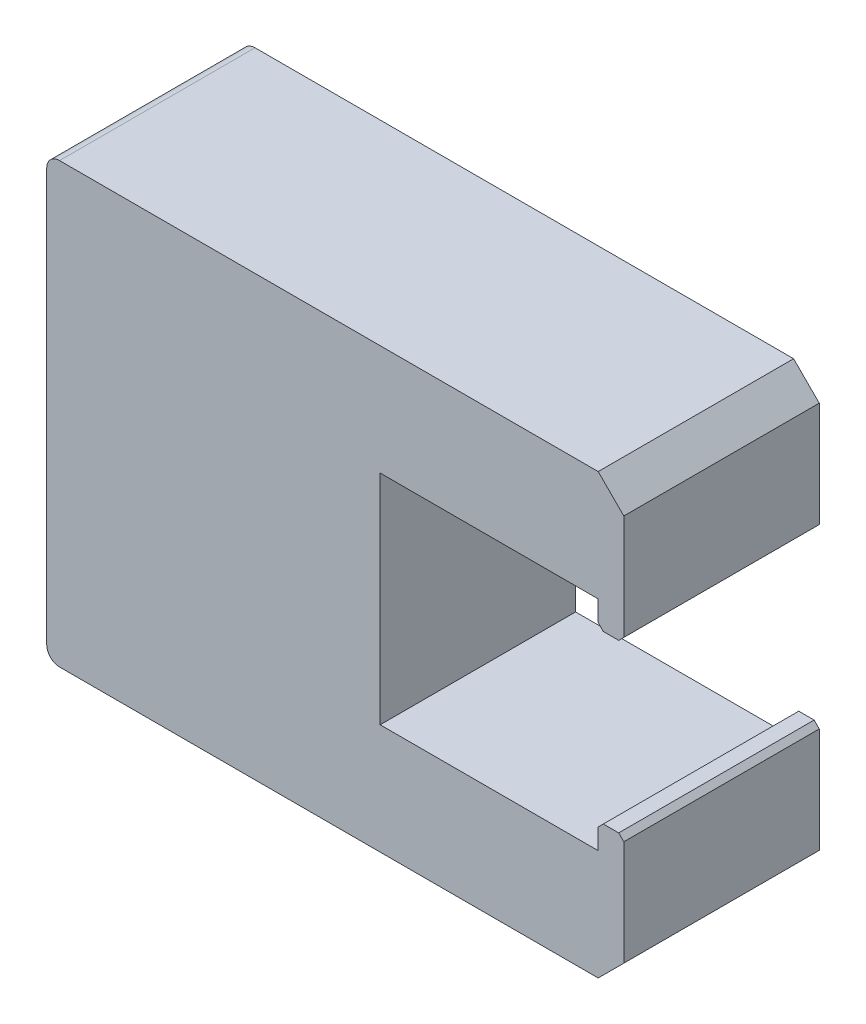
ISO-10303-21;
HEADER;
FILE_DESCRIPTION(('STEP AP214'),'2;1');
FILE_NAME('part.step','',(''),(''),'','','');
FILE_SCHEMA(('AUTOMOTIVE_DESIGN { 1 0 10303 214 1 1 1 1 }'));
ENDSEC;
DATA;
#1=APPLICATION_CONTEXT('core data for automotive mechanical design processes');
#2=APPLICATION_PROTOCOL_DEFINITION('international standard','automotive_design',2000,#1);
#3=PRODUCT_CONTEXT('',#1,'mechanical');
#4=PRODUCT('Part','Part','',(#3));
#5=PRODUCT_RELATED_PRODUCT_CATEGORY('part','',(#4));
#6=PRODUCT_DEFINITION_FORMATION('','',#4);
#7=PRODUCT_DEFINITION_CONTEXT('part definition',#1,'design');
#8=PRODUCT_DEFINITION('design','',#6,#7);
#9=PRODUCT_DEFINITION_SHAPE('','',#8);
#10=(LENGTH_UNIT() NAMED_UNIT(*) SI_UNIT(.MILLI.,.METRE.));
#11=(NAMED_UNIT(*) PLANE_ANGLE_UNIT() SI_UNIT($,.RADIAN.));
#12=(NAMED_UNIT(*) SI_UNIT($,.STERADIAN.) SOLID_ANGLE_UNIT());
#13=UNCERTAINTY_MEASURE_WITH_UNIT(LENGTH_MEASURE(1.E-05),#10,'distance_accuracy_value','');
#14=(GEOMETRIC_REPRESENTATION_CONTEXT(3) GLOBAL_UNCERTAINTY_ASSIGNED_CONTEXT((#13)) GLOBAL_UNIT_ASSIGNED_CONTEXT((#10,
#11,#12)) REPRESENTATION_CONTEXT('',''));
#15=CARTESIAN_POINT('',(0.,0.,0.));
#16=DIRECTION('',(0.,0.,1.));
#17=DIRECTION('',(1.,0.,0.));
#18=AXIS2_PLACEMENT_3D('',#15,#16,#17);
#19=CARTESIAN_POINT('',(0.,0.,38.1));
#20=DIRECTION('',(1.,0.,0.));
#21=DIRECTION('',(0.,0.,-1.));
#22=AXIS2_PLACEMENT_3D('',#19,#20,#21);
#23=PLANE('',#22);
#24=DIRECTION('',(0.,-1.,0.));
#25=VECTOR('',#24,1.);
#26=CARTESIAN_POINT('',(0.,0.,38.1));
#27=LINE('',#26,#25);
#28=CARTESIAN_POINT('',(0.,166.,38.1));
#29=VERTEX_POINT('',#28);
#30=CARTESIAN_POINT('',(0.,5.,38.1));
#31=VERTEX_POINT('',#30);
#32=EDGE_CURVE('E245',#29,#31,#27,.T.);
#33=ORIENTED_EDGE('',*,*,#32,.F.);
#34=DIRECTION('',(0.,0.,-1.));
#35=VECTOR('',#34,1.);
#36=CARTESIAN_POINT('',(0.,166.,38.1));
#37=LINE('',#36,#35);
#38=CARTESIAN_POINT('',(0.,166.,-38.1));
#39=VERTEX_POINT('',#38);
#40=EDGE_CURVE('E309',#29,#39,#37,.T.);
#41=ORIENTED_EDGE('',*,*,#40,.T.);
#42=DIRECTION('',(0.,-1.,0.));
#43=VECTOR('',#42,1.);
#44=CARTESIAN_POINT('',(0.,0.,-38.1));
#45=LINE('',#44,#43);
#46=CARTESIAN_POINT('',(0.,5.,-38.1));
#47=VERTEX_POINT('',#46);
#48=EDGE_CURVE('E217',#39,#47,#45,.T.);
#49=ORIENTED_EDGE('',*,*,#48,.T.);
#50=DIRECTION('',(0.,0.,-1.));
#51=VECTOR('',#50,1.);
#52=CARTESIAN_POINT('',(0.,5.,38.1));
#53=LINE('',#52,#51);
#54=EDGE_CURVE('E307',#47,#31,#53,.F.);
#55=ORIENTED_EDGE('',*,*,#54,.T.);
#56=EDGE_LOOP('',(#33,#41,#49,#55));
#57=FACE_BOUND('',#56,.T.);
#58=ADVANCED_FACE('F34',(#57),#23,.F.);
#59=CARTESIAN_POINT('',(0.,0.,38.1));
#60=DIRECTION('',(0.,1.,0.));
#61=DIRECTION('',(0.,0.,1.));
#62=AXIS2_PLACEMENT_3D('',#59,#60,#61);
#63=PLANE('',#62);
#64=DIRECTION('',(1.,0.,0.));
#65=VECTOR('',#64,1.);
#66=CARTESIAN_POINT('',(0.,0.,38.1));
#67=LINE('',#66,#65);
#68=CARTESIAN_POINT('',(5.,0.,38.1));
#69=VERTEX_POINT('',#68);
#70=CARTESIAN_POINT('',(215.,0.,38.1));
#71=VERTEX_POINT('',#70);
#72=EDGE_CURVE('E324',#69,#71,#67,.T.);
#73=ORIENTED_EDGE('',*,*,#72,.F.);
#74=DIRECTION('',(0.,0.,-1.));
#75=VECTOR('',#74,1.);
#76=CARTESIAN_POINT('',(5.,0.,38.1));
#77=LINE('',#76,#75);
#78=CARTESIAN_POINT('',(5.,0.,-38.1));
#79=VERTEX_POINT('',#78);
#80=EDGE_CURVE('E11',#69,#79,#77,.T.);
#81=ORIENTED_EDGE('',*,*,#80,.T.);
#82=DIRECTION('',(1.,0.,0.));
#83=VECTOR('',#82,1.);
#84=CARTESIAN_POINT('',(0.,0.,-38.1));
#85=LINE('',#84,#83);
#86=CARTESIAN_POINT('',(215.,0.,-38.1));
#87=VERTEX_POINT('',#86);
#88=EDGE_CURVE('E220',#79,#87,#85,.T.);
#89=ORIENTED_EDGE('',*,*,#88,.T.);
#90=DIRECTION('',(0.,0.,1.));
#91=VECTOR('',#90,1.);
#92=CARTESIAN_POINT('',(215.,0.,38.1));
#93=LINE('',#92,#91);
#94=EDGE_CURVE('E270',#87,#71,#93,.T.);
#95=ORIENTED_EDGE('',*,*,#94,.T.);
#96=EDGE_LOOP('',(#73,#81,#89,#95));
#97=FACE_BOUND('',#96,.T.);
#98=ADVANCED_FACE('F376',(#97),#63,.F.);
#99=CARTESIAN_POINT('',(225.,0.,38.1));
#100=DIRECTION('',(-1.,0.,0.));
#101=DIRECTION('',(0.,0.,1.));
#102=AXIS2_PLACEMENT_3D('',#99,#100,#101);
#103=PLANE('',#102);
#104=DIRECTION('',(0.,1.,0.));
#105=VECTOR('',#104,1.);
#106=CARTESIAN_POINT('',(225.,0.,-38.1));
#107=LINE('',#106,#105);
#108=CARTESIAN_POINT('',(225.,9.99999999999998,-38.1));
#109=VERTEX_POINT('',#108);
#110=CARTESIAN_POINT('',(225.,51.,-38.1));
#111=VERTEX_POINT('',#110);
#112=EDGE_CURVE('E222',#109,#111,#107,.T.);
#113=ORIENTED_EDGE('',*,*,#112,.T.);
#114=DIRECTION('',(0.,0.,1.));
#115=VECTOR('',#114,1.);
#116=CARTESIAN_POINT('',(225.,51.,38.1));
#117=LINE('',#116,#115);
#118=CARTESIAN_POINT('',(225.,51.,38.1));
#119=VERTEX_POINT('',#118);
#120=EDGE_CURVE('E305',#111,#119,#117,.T.);
#121=ORIENTED_EDGE('',*,*,#120,.T.);
#122=DIRECTION('',(0.,1.,0.));
#123=VECTOR('',#122,1.);
#124=CARTESIAN_POINT('',(225.,0.,38.1));
#125=LINE('',#124,#123);
#126=CARTESIAN_POINT('',(225.,10.,38.1));
#127=VERTEX_POINT('',#126);
#128=EDGE_CURVE('E418',#127,#119,#125,.T.);
#129=ORIENTED_EDGE('',*,*,#128,.F.);
#130=DIRECTION('',(0.,0.,-1.));
#131=VECTOR('',#130,1.);
#132=CARTESIAN_POINT('',(225.,10.,38.1));
#133=LINE('',#132,#131);
#134=EDGE_CURVE('E267',#127,#109,#133,.T.);
#135=ORIENTED_EDGE('',*,*,#134,.T.);
#136=EDGE_LOOP('',(#113,#121,#129,#135));
#137=FACE_BOUND('',#136,.T.);
#138=ADVANCED_FACE('F381',(#137),#103,.F.);
#139=CARTESIAN_POINT('',(215.,53.,38.1));
#140=DIRECTION('',(0.,-1.,0.));
#141=DIRECTION('',(0.,0.,-1.));
#142=AXIS2_PLACEMENT_3D('',#139,#140,#141);
#143=PLANE('',#142);
#144=DIRECTION('',(-1.,0.,0.));
#145=VECTOR('',#144,1.);
#146=CARTESIAN_POINT('',(215.,53.,-38.1));
#147=LINE('',#146,#145);
#148=CARTESIAN_POINT('',(223.,53.,-38.1));
#149=VERTEX_POINT('',#148);
#150=CARTESIAN_POINT('',(217.,53.,-38.1));
#151=VERTEX_POINT('',#150);
#152=EDGE_CURVE('E225',#149,#151,#147,.T.);
#153=ORIENTED_EDGE('',*,*,#152,.T.);
#154=DIRECTION('',(0.,0.,1.));
#155=VECTOR('',#154,1.);
#156=CARTESIAN_POINT('',(217.,53.,38.1));
#157=LINE('',#156,#155);
#158=CARTESIAN_POINT('',(217.,53.,38.1));
#159=VERTEX_POINT('',#158);
#160=EDGE_CURVE('E300',#151,#159,#157,.T.);
#161=ORIENTED_EDGE('',*,*,#160,.T.);
#162=DIRECTION('',(-1.,0.,0.));
#163=VECTOR('',#162,1.);
#164=CARTESIAN_POINT('',(215.,53.,38.1));
#165=LINE('',#164,#163);
#166=CARTESIAN_POINT('',(223.,53.,38.1));
#167=VERTEX_POINT('',#166);
#168=EDGE_CURVE('E184',#167,#159,#165,.T.);
#169=ORIENTED_EDGE('',*,*,#168,.F.);
#170=DIRECTION('',(0.,0.,-1.));
#171=VECTOR('',#170,1.);
#172=CARTESIAN_POINT('',(223.,53.,38.1));
#173=LINE('',#172,#171);
#174=EDGE_CURVE('E297',#167,#149,#173,.T.);
#175=ORIENTED_EDGE('',*,*,#174,.T.);
#176=EDGE_LOOP('',(#153,#161,#169,#175));
#177=FACE_BOUND('',#176,.T.);
#178=ADVANCED_FACE('F429',(#177),#143,.F.);
#179=CARTESIAN_POINT('',(215.,43.,38.1));
#180=DIRECTION('',(1.,0.,0.));
#181=DIRECTION('',(0.,0.,-1.));
#182=AXIS2_PLACEMENT_3D('',#179,#180,#181);
#183=PLANE('',#182);
#184=DIRECTION('',(0.,-1.,0.));
#185=VECTOR('',#184,1.);
#186=CARTESIAN_POINT('',(215.,43.,38.1));
#187=LINE('',#186,#185);
#188=CARTESIAN_POINT('',(215.,51.,38.1));
#189=VERTEX_POINT('',#188);
#190=CARTESIAN_POINT('',(215.,43.,38.1));
#191=VERTEX_POINT('',#190);
#192=EDGE_CURVE('E172',#189,#191,#187,.T.);
#193=ORIENTED_EDGE('',*,*,#192,.F.);
#194=DIRECTION('',(0.,0.,-1.));
#195=VECTOR('',#194,1.);
#196=CARTESIAN_POINT('',(215.,51.,38.1));
#197=LINE('',#196,#195);
#198=CARTESIAN_POINT('',(215.,51.,-38.1));
#199=VERTEX_POINT('',#198);
#200=EDGE_CURVE('E295',#189,#199,#197,.T.);
#201=ORIENTED_EDGE('',*,*,#200,.T.);
#202=DIRECTION('',(0.,-1.,0.));
#203=VECTOR('',#202,1.);
#204=CARTESIAN_POINT('',(215.,43.,-38.1));
#205=LINE('',#204,#203);
#206=CARTESIAN_POINT('',(215.,43.,-38.1));
#207=VERTEX_POINT('',#206);
#208=EDGE_CURVE('E190',#199,#207,#205,.T.);
#209=ORIENTED_EDGE('',*,*,#208,.T.);
#210=DIRECTION('',(0.,0.,-1.));
#211=VECTOR('',#210,1.);
#212=CARTESIAN_POINT('',(215.,43.,38.1));
#213=LINE('',#212,#211);
#214=EDGE_CURVE('E187',#191,#207,#213,.T.);
#215=ORIENTED_EDGE('',*,*,#214,.F.);
#216=EDGE_LOOP('',(#193,#201,#209,#215));
#217=FACE_BOUND('',#216,.T.);
#218=ADVANCED_FACE('F188',(#217),#183,.F.);
#219=CARTESIAN_POINT('',(215.,43.,38.1));
#220=DIRECTION('',(0.,-1.,0.));
#221=DIRECTION('',(1.,0.,0.));
#222=AXIS2_PLACEMENT_3D('',#219,#220,#221);
#223=PLANE('',#222);
#224=DIRECTION('',(-1.,0.,0.));
#225=VECTOR('',#224,1.);
#226=CARTESIAN_POINT('',(215.,43.,-38.1));
#227=LINE('',#226,#225);
#228=CARTESIAN_POINT('',(130.,43.,-38.1));
#229=VERTEX_POINT('',#228);
#230=EDGE_CURVE('E229',#207,#229,#227,.T.);
#231=ORIENTED_EDGE('',*,*,#230,.T.);
#232=DIRECTION('',(0.,0.,-1.));
#233=VECTOR('',#232,1.);
#234=CARTESIAN_POINT('',(130.,43.,38.1));
#235=LINE('',#234,#233);
#236=CARTESIAN_POINT('',(130.,43.,38.1));
#237=VERTEX_POINT('',#236);
#238=EDGE_CURVE('E194',#237,#229,#235,.T.);
#239=ORIENTED_EDGE('',*,*,#238,.F.);
#240=DIRECTION('',(-1.,0.,0.));
#241=VECTOR('',#240,1.);
#242=CARTESIAN_POINT('',(215.,43.,38.1));
#243=LINE('',#242,#241);
#244=EDGE_CURVE('E176',#191,#237,#243,.T.);
#245=ORIENTED_EDGE('',*,*,#244,.F.);
#246=ORIENTED_EDGE('',*,*,#214,.T.);
#247=EDGE_LOOP('',(#231,#239,#245,#246));
#248=FACE_BOUND('',#247,.T.);
#249=ADVANCED_FACE('F196',(#248),#223,.F.);
#250=CARTESIAN_POINT('',(130.,128.,38.1));
#251=DIRECTION('',(-1.,0.,0.));
#252=DIRECTION('',(0.,0.,1.));
#253=AXIS2_PLACEMENT_3D('',#250,#251,#252);
#254=PLANE('',#253);
#255=DIRECTION('',(0.,1.,0.));
#256=VECTOR('',#255,1.);
#257=CARTESIAN_POINT('',(130.,128.,-38.1));
#258=LINE('',#257,#256);
#259=CARTESIAN_POINT('',(130.,128.,-38.1));
#260=VERTEX_POINT('',#259);
#261=EDGE_CURVE('E231',#229,#260,#258,.T.);
#262=ORIENTED_EDGE('',*,*,#261,.T.);
#263=DIRECTION('',(0.,0.,-1.));
#264=VECTOR('',#263,1.);
#265=CARTESIAN_POINT('',(130.,128.,38.1));
#266=LINE('',#265,#264);
#267=CARTESIAN_POINT('',(130.,128.,38.1));
#268=VERTEX_POINT('',#267);
#269=EDGE_CURVE('E248',#268,#260,#266,.T.);
#270=ORIENTED_EDGE('',*,*,#269,.F.);
#271=DIRECTION('',(0.,1.,0.));
#272=VECTOR('',#271,1.);
#273=CARTESIAN_POINT('',(130.,128.,38.1));
#274=LINE('',#273,#272);
#275=EDGE_CURVE('E199',#237,#268,#274,.T.);
#276=ORIENTED_EDGE('',*,*,#275,.F.);
#277=ORIENTED_EDGE('',*,*,#238,.T.);
#278=EDGE_LOOP('',(#262,#270,#276,#277));
#279=FACE_BOUND('',#278,.T.);
#280=ADVANCED_FACE('F366',(#279),#254,.F.);
#281=CARTESIAN_POINT('',(215.,128.,38.1));
#282=DIRECTION('',(0.,1.,0.));
#283=DIRECTION('',(0.,0.,1.));
#284=AXIS2_PLACEMENT_3D('',#281,#282,#283);
#285=PLANE('',#284);
#286=DIRECTION('',(1.,0.,0.));
#287=VECTOR('',#286,1.);
#288=CARTESIAN_POINT('',(215.,128.,-38.1));
#289=LINE('',#288,#287);
#290=CARTESIAN_POINT('',(215.,128.,-38.1));
#291=VERTEX_POINT('',#290);
#292=EDGE_CURVE('E233',#260,#291,#289,.T.);
#293=ORIENTED_EDGE('',*,*,#292,.T.);
#294=DIRECTION('',(0.,0.,-1.));
#295=VECTOR('',#294,1.);
#296=CARTESIAN_POINT('',(215.,128.,38.1));
#297=LINE('',#296,#295);
#298=CARTESIAN_POINT('',(215.,128.,38.1));
#299=VERTEX_POINT('',#298);
#300=EDGE_CURVE('E216',#299,#291,#297,.T.);
#301=ORIENTED_EDGE('',*,*,#300,.F.);
#302=DIRECTION('',(1.,0.,0.));
#303=VECTOR('',#302,1.);
#304=CARTESIAN_POINT('',(215.,128.,38.1));
#305=LINE('',#304,#303);
#306=EDGE_CURVE('E201',#268,#299,#305,.T.);
#307=ORIENTED_EDGE('',*,*,#306,.F.);
#308=ORIENTED_EDGE('',*,*,#269,.T.);
#309=EDGE_LOOP('',(#293,#301,#307,#308));
#310=FACE_BOUND('',#309,.T.);
#311=ADVANCED_FACE('F362',(#310),#285,.F.);
#312=CARTESIAN_POINT('',(215.,128.,38.1));
#313=DIRECTION('',(1.,0.,0.));
#314=DIRECTION('',(0.,1.,0.));
#315=AXIS2_PLACEMENT_3D('',#312,#313,#314);
#316=PLANE('',#315);
#317=DIRECTION('',(0.,-1.,0.));
#318=VECTOR('',#317,1.);
#319=CARTESIAN_POINT('',(215.,128.,-38.1));
#320=LINE('',#319,#318);
#321=CARTESIAN_POINT('',(215.,120.,-38.1));
#322=VERTEX_POINT('',#321);
#323=EDGE_CURVE('E235',#291,#322,#320,.T.);
#324=ORIENTED_EDGE('',*,*,#323,.T.);
#325=DIRECTION('',(0.,0.,1.));
#326=VECTOR('',#325,1.);
#327=CARTESIAN_POINT('',(215.,120.,38.1));
#328=LINE('',#327,#326);
#329=CARTESIAN_POINT('',(215.,120.,38.1));
#330=VERTEX_POINT('',#329);
#331=EDGE_CURVE('E286',#322,#330,#328,.T.);
#332=ORIENTED_EDGE('',*,*,#331,.T.);
#333=DIRECTION('',(0.,-1.,0.));
#334=VECTOR('',#333,1.);
#335=CARTESIAN_POINT('',(215.,128.,38.1));
#336=LINE('',#335,#334);
#337=EDGE_CURVE('E206',#299,#330,#336,.T.);
#338=ORIENTED_EDGE('',*,*,#337,.F.);
#339=ORIENTED_EDGE('',*,*,#300,.T.);
#340=EDGE_LOOP('',(#324,#332,#338,#339));
#341=FACE_BOUND('',#340,.T.);
#342=ADVANCED_FACE('F358',(#341),#316,.F.);
#343=CARTESIAN_POINT('',(215.,118.,38.1));
#344=DIRECTION('',(0.,1.,0.));
#345=DIRECTION('',(-1.,0.,0.));
#346=AXIS2_PLACEMENT_3D('',#343,#344,#345);
#347=PLANE('',#346);
#348=DIRECTION('',(1.,0.,0.));
#349=VECTOR('',#348,1.);
#350=CARTESIAN_POINT('',(215.,118.,38.1));
#351=LINE('',#350,#349);
#352=CARTESIAN_POINT('',(217.,118.,38.1));
#353=VERTEX_POINT('',#352);
#354=CARTESIAN_POINT('',(223.,118.,38.1));
#355=VERTEX_POINT('',#354);
#356=EDGE_CURVE('E209',#353,#355,#351,.T.);
#357=ORIENTED_EDGE('',*,*,#356,.F.);
#358=DIRECTION('',(0.,0.,-1.));
#359=VECTOR('',#358,1.);
#360=CARTESIAN_POINT('',(217.,118.,38.1));
#361=LINE('',#360,#359);
#362=CARTESIAN_POINT('',(217.,118.,-38.1));
#363=VERTEX_POINT('',#362);
#364=EDGE_CURVE('E275',#353,#363,#361,.T.);
#365=ORIENTED_EDGE('',*,*,#364,.T.);
#366=DIRECTION('',(1.,0.,0.));
#367=VECTOR('',#366,1.);
#368=CARTESIAN_POINT('',(215.,118.,-38.1));
#369=LINE('',#368,#367);
#370=CARTESIAN_POINT('',(223.,118.,-38.1));
#371=VERTEX_POINT('',#370);
#372=EDGE_CURVE('E238',#363,#371,#369,.T.);
#373=ORIENTED_EDGE('',*,*,#372,.T.);
#374=DIRECTION('',(0.,0.,1.));
#375=VECTOR('',#374,1.);
#376=CARTESIAN_POINT('',(223.,118.,38.1));
#377=LINE('',#376,#375);
#378=EDGE_CURVE('E273',#371,#355,#377,.T.);
#379=ORIENTED_EDGE('',*,*,#378,.T.);
#380=EDGE_LOOP('',(#357,#365,#373,#379));
#381=FACE_BOUND('',#380,.T.);
#382=ADVANCED_FACE('F348',(#381),#347,.F.);
#383=CARTESIAN_POINT('',(225.,171.,38.1));
#384=DIRECTION('',(-1.,0.,0.));
#385=DIRECTION('',(0.,-1.,0.));
#386=AXIS2_PLACEMENT_3D('',#383,#384,#385);
#387=PLANE('',#386);
#388=DIRECTION('',(0.,1.,0.));
#389=VECTOR('',#388,1.);
#390=CARTESIAN_POINT('',(225.,171.,38.1));
#391=LINE('',#390,#389);
#392=CARTESIAN_POINT('',(225.,120.,38.1));
#393=VERTEX_POINT('',#392);
#394=CARTESIAN_POINT('',(225.,161.,38.1));
#395=VERTEX_POINT('',#394);
#396=EDGE_CURVE('E212',#393,#395,#391,.T.);
#397=ORIENTED_EDGE('',*,*,#396,.F.);
#398=DIRECTION('',(0.,0.,-1.));
#399=VECTOR('',#398,1.);
#400=CARTESIAN_POINT('',(225.,120.,38.1));
#401=LINE('',#400,#399);
#402=CARTESIAN_POINT('',(225.,120.,-38.1));
#403=VERTEX_POINT('',#402);
#404=EDGE_CURVE('E302',#393,#403,#401,.T.);
#405=ORIENTED_EDGE('',*,*,#404,.T.);
#406=DIRECTION('',(0.,1.,0.));
#407=VECTOR('',#406,1.);
#408=CARTESIAN_POINT('',(225.,171.,-38.1));
#409=LINE('',#408,#407);
#410=CARTESIAN_POINT('',(225.,161.,-38.1));
#411=VERTEX_POINT('',#410);
#412=EDGE_CURVE('E241',#403,#411,#409,.T.);
#413=ORIENTED_EDGE('',*,*,#412,.T.);
#414=DIRECTION('',(0.,0.,1.));
#415=VECTOR('',#414,1.);
#416=CARTESIAN_POINT('',(225.,161.,38.1));
#417=LINE('',#416,#415);
#418=EDGE_CURVE('E260',#411,#395,#417,.T.);
#419=ORIENTED_EDGE('',*,*,#418,.T.);
#420=EDGE_LOOP('',(#397,#405,#413,#419));
#421=FACE_BOUND('',#420,.T.);
#422=ADVANCED_FACE('F340',(#421),#387,.F.);
#423=CARTESIAN_POINT('',(0.,171.,38.1));
#424=DIRECTION('',(0.,-1.,0.));
#425=DIRECTION('',(0.,0.,-1.));
#426=AXIS2_PLACEMENT_3D('',#423,#424,#425);
#427=PLANE('',#426);
#428=DIRECTION('',(-1.,0.,0.));
#429=VECTOR('',#428,1.);
#430=CARTESIAN_POINT('',(0.,171.,-38.1));
#431=LINE('',#430,#429);
#432=CARTESIAN_POINT('',(215.,171.,-38.1));
#433=VERTEX_POINT('',#432);
#434=CARTESIAN_POINT('',(5.,171.,-38.1));
#435=VERTEX_POINT('',#434);
#436=EDGE_CURVE('E243',#433,#435,#431,.T.);
#437=ORIENTED_EDGE('',*,*,#436,.T.);
#438=DIRECTION('',(0.,0.,-1.));
#439=VECTOR('',#438,1.);
#440=CARTESIAN_POINT('',(5.,171.,38.1));
#441=LINE('',#440,#439);
#442=CARTESIAN_POINT('',(5.,171.,38.1));
#443=VERTEX_POINT('',#442);
#444=EDGE_CURVE('E57',#435,#443,#441,.F.);
#445=ORIENTED_EDGE('',*,*,#444,.T.);
#446=DIRECTION('',(-1.,0.,0.));
#447=VECTOR('',#446,1.);
#448=CARTESIAN_POINT('',(0.,171.,38.1));
#449=LINE('',#448,#447);
#450=CARTESIAN_POINT('',(215.,171.,38.1));
#451=VERTEX_POINT('',#450);
#452=EDGE_CURVE('E214',#451,#443,#449,.T.);
#453=ORIENTED_EDGE('',*,*,#452,.F.);
#454=DIRECTION('',(0.,0.,-1.));
#455=VECTOR('',#454,1.);
#456=CARTESIAN_POINT('',(215.,171.,38.1));
#457=LINE('',#456,#455);
#458=EDGE_CURVE('E193',#451,#433,#457,.T.);
#459=ORIENTED_EDGE('',*,*,#458,.T.);
#460=EDGE_LOOP('',(#437,#445,#453,#459));
#461=FACE_BOUND('',#460,.T.);
#462=ADVANCED_FACE('F330',(#461),#427,.F.);
#463=CARTESIAN_POINT('',(0.,0.,38.1));
#464=DIRECTION('',(0.,0.,-1.));
#465=DIRECTION('',(-1.,0.,0.));
#466=AXIS2_PLACEMENT_3D('',#463,#464,#465);
#467=PLANE('',#466);
#468=ORIENTED_EDGE('',*,*,#452,.T.);
#469=CARTESIAN_POINT('',(5.,166.,38.1));
#470=DIRECTION('',(0.,0.,-1.));
#471=DIRECTION('',(-1.,0.,0.));
#472=AXIS2_PLACEMENT_3D('',#469,#470,#471);
#473=CIRCLE('',#472,5.);
#474=EDGE_CURVE('E42',#443,#29,#473,.F.);
#475=ORIENTED_EDGE('',*,*,#474,.T.);
#476=ORIENTED_EDGE('',*,*,#32,.T.);
#477=CARTESIAN_POINT('',(5.,5.,38.1));
#478=DIRECTION('',(0.,0.,-1.));
#479=DIRECTION('',(-1.,0.,0.));
#480=AXIS2_PLACEMENT_3D('',#477,#478,#479);
#481=CIRCLE('',#480,5.);
#482=EDGE_CURVE('E49',#31,#69,#481,.F.);
#483=ORIENTED_EDGE('',*,*,#482,.T.);
#484=ORIENTED_EDGE('',*,*,#72,.T.);
#485=DIRECTION('',(-0.707106781186549,-0.707106781186546,0.));
#486=VECTOR('',#485,1.);
#487=CARTESIAN_POINT('',(225.,10.,38.1));
#488=LINE('',#487,#486);
#489=EDGE_CURVE('E263',#71,#127,#488,.F.);
#490=ORIENTED_EDGE('',*,*,#489,.T.);
#491=ORIENTED_EDGE('',*,*,#128,.T.);
#492=DIRECTION('',(0.707106781186548,-0.707106781186548,0.));
#493=VECTOR('',#492,1.);
#494=CARTESIAN_POINT('',(223.,53.,38.1));
#495=LINE('',#494,#493);
#496=EDGE_CURVE('E288',#119,#167,#495,.F.);
#497=ORIENTED_EDGE('',*,*,#496,.T.);
#498=ORIENTED_EDGE('',*,*,#168,.T.);
#499=DIRECTION('',(0.707106781186548,0.707106781186548,0.));
#500=VECTOR('',#499,1.);
#501=CARTESIAN_POINT('',(215.,51.,38.1));
#502=LINE('',#501,#500);
#503=EDGE_CURVE('E180',#159,#189,#502,.F.);
#504=ORIENTED_EDGE('',*,*,#503,.T.);
#505=ORIENTED_EDGE('',*,*,#192,.T.);
#506=ORIENTED_EDGE('',*,*,#244,.T.);
#507=ORIENTED_EDGE('',*,*,#275,.T.);
#508=ORIENTED_EDGE('',*,*,#306,.T.);
#509=ORIENTED_EDGE('',*,*,#337,.T.);
#510=DIRECTION('',(-0.707106781186548,0.707106781186548,0.));
#511=VECTOR('',#510,1.);
#512=CARTESIAN_POINT('',(217.,118.,38.1));
#513=LINE('',#512,#511);
#514=EDGE_CURVE('E293',#330,#353,#513,.F.);
#515=ORIENTED_EDGE('',*,*,#514,.T.);
#516=ORIENTED_EDGE('',*,*,#356,.T.);
#517=DIRECTION('',(-0.707106781186552,-0.707106781186543,0.));
#518=VECTOR('',#517,1.);
#519=CARTESIAN_POINT('',(225.,120.,38.1));
#520=LINE('',#519,#518);
#521=EDGE_CURVE('E290',#355,#393,#520,.F.);
#522=ORIENTED_EDGE('',*,*,#521,.T.);
#523=ORIENTED_EDGE('',*,*,#396,.T.);
#524=DIRECTION('',(0.707106781186548,-0.707106781186548,0.));
#525=VECTOR('',#524,1.);
#526=CARTESIAN_POINT('',(215.,171.,38.1));
#527=LINE('',#526,#525);
#528=EDGE_CURVE('E265',#395,#451,#527,.F.);
#529=ORIENTED_EDGE('',*,*,#528,.T.);
#530=EDGE_LOOP('',(#468,#475,#476,#483,#484,#490,#491,#497,#498,#504,#505,#506,#507,#508,#509,
#515,#516,#522,#523,#529));
#531=FACE_BOUND('',#530,.T.);
#532=ADVANCED_FACE('F174',(#531),#467,.F.);
#533=CARTESIAN_POINT('',(0.,0.,-38.1));
#534=DIRECTION('',(0.,0.,-1.));
#535=DIRECTION('',(-1.,0.,0.));
#536=AXIS2_PLACEMENT_3D('',#533,#534,#535);
#537=PLANE('',#536);
#538=ORIENTED_EDGE('',*,*,#48,.F.);
#539=CARTESIAN_POINT('',(5.,166.,-38.1));
#540=DIRECTION('',(0.,0.,-1.));
#541=DIRECTION('',(-1.,0.,0.));
#542=AXIS2_PLACEMENT_3D('',#539,#540,#541);
#543=CIRCLE('',#542,5.);
#544=EDGE_CURVE('E314',#39,#435,#543,.T.);
#545=ORIENTED_EDGE('',*,*,#544,.T.);
#546=ORIENTED_EDGE('',*,*,#436,.F.);
#547=DIRECTION('',(-0.707106781186548,0.707106781186548,0.));
#548=VECTOR('',#547,1.);
#549=CARTESIAN_POINT('',(193.,193.,-38.1));
#550=LINE('',#549,#548);
#551=EDGE_CURVE('E257',#433,#411,#550,.F.);
#552=ORIENTED_EDGE('',*,*,#551,.T.);
#553=ORIENTED_EDGE('',*,*,#412,.F.);
#554=DIRECTION('',(0.707106781186552,0.707106781186543,0.));
#555=VECTOR('',#554,1.);
#556=CARTESIAN_POINT('',(52.4999999999985,-52.4999999999992,-38.1));
#557=LINE('',#556,#555);
#558=EDGE_CURVE('E280',#403,#371,#557,.F.);
#559=ORIENTED_EDGE('',*,*,#558,.T.);
#560=ORIENTED_EDGE('',*,*,#372,.F.);
#561=DIRECTION('',(0.707106781186548,-0.707106781186548,0.));
#562=VECTOR('',#561,1.);
#563=CARTESIAN_POINT('',(167.5,167.5,-38.1));
#564=LINE('',#563,#562);
#565=EDGE_CURVE('E284',#363,#322,#564,.F.);
#566=ORIENTED_EDGE('',*,*,#565,.T.);
#567=ORIENTED_EDGE('',*,*,#323,.F.);
#568=ORIENTED_EDGE('',*,*,#292,.F.);
#569=ORIENTED_EDGE('',*,*,#261,.F.);
#570=ORIENTED_EDGE('',*,*,#230,.F.);
#571=ORIENTED_EDGE('',*,*,#208,.F.);
#572=DIRECTION('',(-0.707106781186548,-0.707106781186548,0.));
#573=VECTOR('',#572,1.);
#574=CARTESIAN_POINT('',(82.,-82.,-38.1));
#575=LINE('',#574,#573);
#576=EDGE_CURVE('E282',#199,#151,#575,.F.);
#577=ORIENTED_EDGE('',*,*,#576,.T.);
#578=ORIENTED_EDGE('',*,*,#152,.F.);
#579=DIRECTION('',(-0.707106781186548,0.707106781186548,0.));
#580=VECTOR('',#579,1.);
#581=CARTESIAN_POINT('',(138.,138.,-38.1));
#582=LINE('',#581,#580);
#583=EDGE_CURVE('E278',#149,#111,#582,.F.);
#584=ORIENTED_EDGE('',*,*,#583,.T.);
#585=ORIENTED_EDGE('',*,*,#112,.F.);
#586=DIRECTION('',(0.707106781186549,0.707106781186546,0.));
#587=VECTOR('',#586,1.);
#588=CARTESIAN_POINT('',(107.499999999999,-107.5,-38.1));
#589=LINE('',#588,#587);
#590=EDGE_CURVE('E254',#109,#87,#589,.F.);
#591=ORIENTED_EDGE('',*,*,#590,.T.);
#592=ORIENTED_EDGE('',*,*,#88,.F.);
#593=CARTESIAN_POINT('',(5.,5.,-38.1));
#594=DIRECTION('',(0.,0.,-1.));
#595=DIRECTION('',(-1.,0.,0.));
#596=AXIS2_PLACEMENT_3D('',#593,#594,#595);
#597=CIRCLE('',#596,5.);
#598=EDGE_CURVE('E312',#79,#47,#597,.T.);
#599=ORIENTED_EDGE('',*,*,#598,.T.);
#600=EDGE_LOOP('',(#538,#545,#546,#552,#553,#559,#560,#566,#567,#568,#569,#570,#571,#577,#578,
#584,#585,#591,#592,#599));
#601=FACE_BOUND('',#600,.T.);
#602=ADVANCED_FACE('F329',(#601),#537,.T.);
#603=CARTESIAN_POINT('',(215.,171.,38.1));
#604=DIRECTION('',(-0.707106781186547,-0.707106781186547,0.));
#605=DIRECTION('',(0.,0.,-1.));
#606=AXIS2_PLACEMENT_3D('',#603,#604,#605);
#607=PLANE('',#606);
#608=ORIENTED_EDGE('',*,*,#528,.F.);
#609=ORIENTED_EDGE('',*,*,#418,.F.);
#610=ORIENTED_EDGE('',*,*,#551,.F.);
#611=ORIENTED_EDGE('',*,*,#458,.F.);
#612=EDGE_LOOP('',(#608,#609,#610,#611));
#613=FACE_BOUND('',#612,.T.);
#614=ADVANCED_FACE('F334',(#613),#607,.F.);
#615=CARTESIAN_POINT('',(225.,10.,38.1));
#616=DIRECTION('',(-0.707106781186545,0.707106781186549,0.));
#617=DIRECTION('',(0.,0.,-1.));
#618=AXIS2_PLACEMENT_3D('',#615,#616,#617);
#619=PLANE('',#618);
#620=ORIENTED_EDGE('',*,*,#489,.F.);
#621=ORIENTED_EDGE('',*,*,#94,.F.);
#622=ORIENTED_EDGE('',*,*,#590,.F.);
#623=ORIENTED_EDGE('',*,*,#134,.F.);
#624=EDGE_LOOP('',(#620,#621,#622,#623));
#625=FACE_BOUND('',#624,.T.);
#626=ADVANCED_FACE('F388',(#625),#619,.F.);
#627=CARTESIAN_POINT('',(217.,118.,38.1));
#628=DIRECTION('',(0.707106781186547,0.707106781186547,0.));
#629=DIRECTION('',(0.,0.,-1.));
#630=AXIS2_PLACEMENT_3D('',#627,#628,#629);
#631=PLANE('',#630);
#632=ORIENTED_EDGE('',*,*,#514,.F.);
#633=ORIENTED_EDGE('',*,*,#331,.F.);
#634=ORIENTED_EDGE('',*,*,#565,.F.);
#635=ORIENTED_EDGE('',*,*,#364,.F.);
#636=EDGE_LOOP('',(#632,#633,#634,#635));
#637=FACE_BOUND('',#636,.T.);
#638=ADVANCED_FACE('F354',(#637),#631,.F.);
#639=CARTESIAN_POINT('',(215.,51.,38.1));
#640=DIRECTION('',(0.707106781186547,-0.707106781186547,0.));
#641=DIRECTION('',(0.,0.,-1.));
#642=AXIS2_PLACEMENT_3D('',#639,#640,#641);
#643=PLANE('',#642);
#644=ORIENTED_EDGE('',*,*,#503,.F.);
#645=ORIENTED_EDGE('',*,*,#160,.F.);
#646=ORIENTED_EDGE('',*,*,#576,.F.);
#647=ORIENTED_EDGE('',*,*,#200,.F.);
#648=EDGE_LOOP('',(#644,#645,#646,#647));
#649=FACE_BOUND('',#648,.T.);
#650=ADVANCED_FACE('F394',(#649),#643,.F.);
#651=CARTESIAN_POINT('',(225.,120.,38.1));
#652=DIRECTION('',(-0.707106781186542,0.707106781186552,0.));
#653=DIRECTION('',(0.,0.,-1.));
#654=AXIS2_PLACEMENT_3D('',#651,#652,#653);
#655=PLANE('',#654);
#656=ORIENTED_EDGE('',*,*,#521,.F.);
#657=ORIENTED_EDGE('',*,*,#378,.F.);
#658=ORIENTED_EDGE('',*,*,#558,.F.);
#659=ORIENTED_EDGE('',*,*,#404,.F.);
#660=EDGE_LOOP('',(#656,#657,#658,#659));
#661=FACE_BOUND('',#660,.T.);
#662=ADVANCED_FACE('F344',(#661),#655,.F.);
#663=CARTESIAN_POINT('',(223.,53.,38.1));
#664=DIRECTION('',(-0.707106781186547,-0.707106781186547,0.));
#665=DIRECTION('',(0.,0.,-1.));
#666=AXIS2_PLACEMENT_3D('',#663,#664,#665);
#667=PLANE('',#666);
#668=ORIENTED_EDGE('',*,*,#496,.F.);
#669=ORIENTED_EDGE('',*,*,#120,.F.);
#670=ORIENTED_EDGE('',*,*,#583,.F.);
#671=ORIENTED_EDGE('',*,*,#174,.F.);
#672=EDGE_LOOP('',(#668,#669,#670,#671));
#673=FACE_BOUND('',#672,.T.);
#674=ADVANCED_FACE('F400',(#673),#667,.F.);
#675=CARTESIAN_POINT('',(5.,166.,38.1));
#676=DIRECTION('',(0.,0.,-1.));
#677=DIRECTION('',(-1.,0.,0.));
#678=AXIS2_PLACEMENT_3D('',#675,#676,#677);
#679=CYLINDRICAL_SURFACE('',#678,5.);
#680=ORIENTED_EDGE('',*,*,#474,.F.);
#681=ORIENTED_EDGE('',*,*,#444,.F.);
#682=ORIENTED_EDGE('',*,*,#544,.F.);
#683=ORIENTED_EDGE('',*,*,#40,.F.);
#684=EDGE_LOOP('',(#680,#681,#682,#683));
#685=FACE_BOUND('',#684,.T.);
#686=ADVANCED_FACE('F326',(#685),#679,.T.);
#687=CARTESIAN_POINT('',(5.,5.,38.1));
#688=DIRECTION('',(0.,0.,-1.));
#689=DIRECTION('',(-1.,0.,0.));
#690=AXIS2_PLACEMENT_3D('',#687,#688,#689);
#691=CYLINDRICAL_SURFACE('',#690,5.);
#692=ORIENTED_EDGE('',*,*,#482,.F.);
#693=ORIENTED_EDGE('',*,*,#54,.F.);
#694=ORIENTED_EDGE('',*,*,#598,.F.);
#695=ORIENTED_EDGE('',*,*,#80,.F.);
#696=EDGE_LOOP('',(#692,#693,#694,#695));
#697=FACE_BOUND('',#696,.T.);
#698=ADVANCED_FACE('F36',(#697),#691,.T.);
#699=CLOSED_SHELL('',(#58,#98,#138,#178,#218,#249,#280,#311,#342,#382,#422,#462,#532,#602,#614,
#626,#638,#650,#662,#674,#686,#698));
#700=MANIFOLD_SOLID_BREP('B2',#699);
#701=ADVANCED_BREP_SHAPE_REPRESENTATION('',(#18,#700),#14);
#702=SHAPE_DEFINITION_REPRESENTATION(#9,#701);
ENDSEC;
END-ISO-10303-21;
